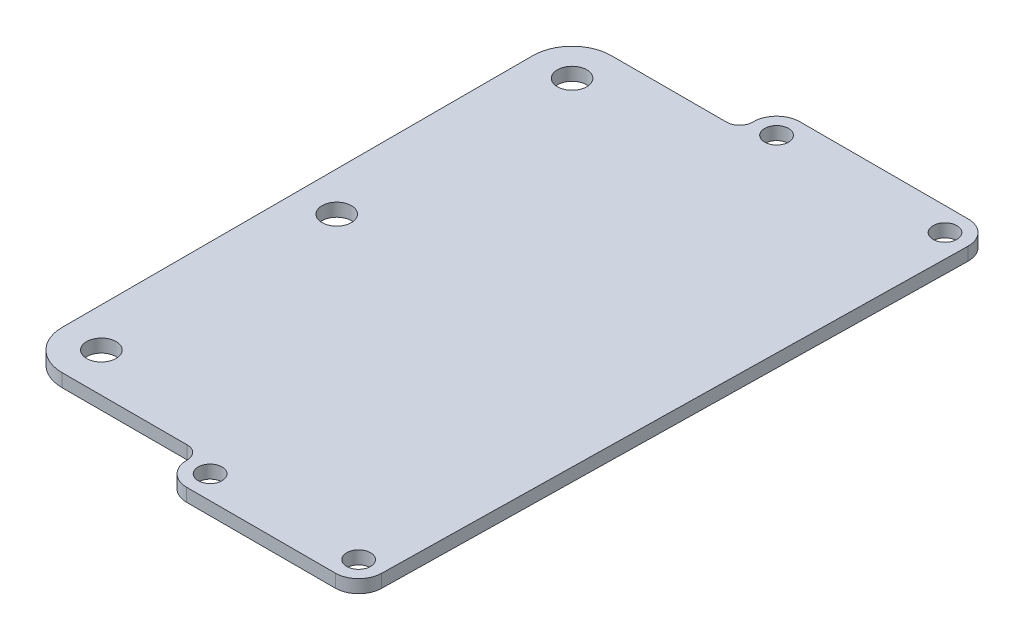
ISO-10303-21;
HEADER;
FILE_DESCRIPTION(('STEP AP214'),'2;1');
FILE_NAME('part.step','',(''),(''),'','','');
FILE_SCHEMA(('AUTOMOTIVE_DESIGN { 1 0 10303 214 1 1 1 1 }'));
ENDSEC;
DATA;
#1=APPLICATION_CONTEXT('core data for automotive mechanical design processes');
#2=APPLICATION_PROTOCOL_DEFINITION('international standard','automotive_design',2000,#1);
#3=PRODUCT_CONTEXT('',#1,'mechanical');
#4=PRODUCT('Part','Part','',(#3));
#5=PRODUCT_RELATED_PRODUCT_CATEGORY('part','',(#4));
#6=PRODUCT_DEFINITION_FORMATION('','',#4);
#7=PRODUCT_DEFINITION_CONTEXT('part definition',#1,'design');
#8=PRODUCT_DEFINITION('design','',#6,#7);
#9=PRODUCT_DEFINITION_SHAPE('','',#8);
#10=(LENGTH_UNIT() NAMED_UNIT(*) SI_UNIT(.MILLI.,.METRE.));
#11=(NAMED_UNIT(*) PLANE_ANGLE_UNIT() SI_UNIT($,.RADIAN.));
#12=(NAMED_UNIT(*) SI_UNIT($,.STERADIAN.) SOLID_ANGLE_UNIT());
#13=UNCERTAINTY_MEASURE_WITH_UNIT(LENGTH_MEASURE(1.E-05),#10,'distance_accuracy_value','');
#14=(GEOMETRIC_REPRESENTATION_CONTEXT(3) GLOBAL_UNCERTAINTY_ASSIGNED_CONTEXT((#13)) GLOBAL_UNIT_ASSIGNED_CONTEXT((#10,
#11,#12)) REPRESENTATION_CONTEXT('',''));
#15=CARTESIAN_POINT('',(0.,0.,0.));
#16=DIRECTION('',(0.,0.,1.));
#17=DIRECTION('',(1.,0.,0.));
#18=AXIS2_PLACEMENT_3D('',#15,#16,#17);
#19=CARTESIAN_POINT('',(0.,128.902574554,0.));
#20=DIRECTION('',(0.,1.,0.));
#21=DIRECTION('',(0.,0.,1.));
#22=AXIS2_PLACEMENT_3D('',#19,#20,#21);
#23=PLANE('',#22);
#24=CARTESIAN_POINT('',(-114.966812484,128.902574554,1163.375334154));
#25=DIRECTION('',(0.,1.,0.));
#26=DIRECTION('',(0.,0.,1.));
#27=AXIS2_PLACEMENT_3D('',#24,#25,#26);
#28=CIRCLE('',#27,3.57124);
#29=CARTESIAN_POINT('',(-114.966812484,128.902574554,1166.946574154));
#30=VERTEX_POINT('',#29);
#31=EDGE_CURVE('E476',#30,#30,#28,.T.);
#32=ORIENTED_EDGE('',*,*,#31,.T.);
#33=EDGE_LOOP('',(#32));
#34=FACE_BOUND('',#33,.T.);
#35=CARTESIAN_POINT('',(-114.966812484,128.902574554,1220.525334154));
#36=DIRECTION('',(0.,1.,0.));
#37=DIRECTION('',(0.,0.,1.));
#38=AXIS2_PLACEMENT_3D('',#35,#36,#37);
#39=CIRCLE('',#38,3.57124);
#40=CARTESIAN_POINT('',(-114.966812484,128.902574554,1224.096574154));
#41=VERTEX_POINT('',#40);
#42=EDGE_CURVE('E486',#41,#41,#39,.T.);
#43=ORIENTED_EDGE('',*,*,#42,.T.);
#44=EDGE_LOOP('',(#43));
#45=FACE_BOUND('',#44,.T.);
#46=CARTESIAN_POINT('',(-114.966812484,128.902574554,1277.675334154));
#47=DIRECTION('',(0.,1.,0.));
#48=DIRECTION('',(0.,0.,1.));
#49=AXIS2_PLACEMENT_3D('',#46,#47,#48);
#50=CIRCLE('',#49,3.57124);
#51=CARTESIAN_POINT('',(-114.966812484,128.902574554,1281.246574154));
#52=VERTEX_POINT('',#51);
#53=EDGE_CURVE('E492',#52,#52,#50,.T.);
#54=ORIENTED_EDGE('',*,*,#53,.T.);
#55=EDGE_LOOP('',(#54));
#56=FACE_BOUND('',#55,.T.);
#57=CARTESIAN_POINT('',(-39.66845,128.902574554,1290.508155834));
#58=DIRECTION('',(0.,-1.,0.));
#59=DIRECTION('',(0.,0.,-1.));
#60=AXIS2_PLACEMENT_3D('',#57,#58,#59);
#61=CIRCLE('',#60,2.9);
#62=CARTESIAN_POINT('',(-39.66845,128.902574554,1287.608155834));
#63=VERTEX_POINT('',#62);
#64=EDGE_CURVE('E495',#63,#63,#61,.T.);
#65=ORIENTED_EDGE('',*,*,#64,.F.);
#66=EDGE_LOOP('',(#65));
#67=FACE_BOUND('',#66,.T.);
#68=CARTESIAN_POINT('',(-37.25545,128.902574554,1150.542512474));
#69=DIRECTION('',(0.,-1.,0.));
#70=DIRECTION('',(0.,0.,-1.));
#71=AXIS2_PLACEMENT_3D('',#68,#69,#70);
#72=CIRCLE('',#71,2.9);
#73=CARTESIAN_POINT('',(-37.25545,128.902574554,1147.642512474));
#74=VERTEX_POINT('',#73);
#75=EDGE_CURVE('E507',#74,#74,#72,.T.);
#76=ORIENTED_EDGE('',*,*,#75,.F.);
#77=EDGE_LOOP('',(#76));
#78=FACE_BOUND('',#77,.T.);
#79=CARTESIAN_POINT('',(-78.14945,128.902574554,1150.542512474));
#80=DIRECTION('',(0.,-1.,0.));
#81=DIRECTION('',(0.,0.,-1.));
#82=AXIS2_PLACEMENT_3D('',#79,#80,#81);
#83=CIRCLE('',#82,2.9);
#84=CARTESIAN_POINT('',(-78.14945,128.902574554,1147.642512474));
#85=VERTEX_POINT('',#84);
#86=EDGE_CURVE('E513',#85,#85,#83,.T.);
#87=ORIENTED_EDGE('',*,*,#86,.F.);
#88=EDGE_LOOP('',(#87));
#89=FACE_BOUND('',#88,.T.);
#90=DIRECTION('',(0.0172373836267811,0.,0.999851425265626));
#91=VECTOR('',#90,1.);
#92=CARTESIAN_POINT('',(-103.629782530336,128.902574554,1.7865717560594));
#93=LINE('',#92,#91);
#94=CARTESIAN_POINT('',(-81.4155265980262,128.902574554,1290.32060546099));
#95=VERTEX_POINT('',#94);
#96=CARTESIAN_POINT('',(-81.4106067913896,128.902574554,1290.60597798527));
#97=VERTEX_POINT('',#96);
#98=EDGE_CURVE('E150',#95,#97,#93,.T.);
#99=ORIENTED_EDGE('',*,*,#98,.F.);
#100=CARTESIAN_POINT('',(-84.5900548732446,128.902574554,1290.375334154));
#101=DIRECTION('',(0.,1.,0.));
#102=DIRECTION('',(0.,0.,1.));
#103=AXIS2_PLACEMENT_3D('',#100,#101,#102);
#104=CIRCLE('',#103,3.175);
#105=CARTESIAN_POINT('',(-84.5900548732446,128.902574554,1287.200334154));
#106=VERTEX_POINT('',#105);
#107=EDGE_CURVE('E267',#95,#106,#104,.T.);
#108=ORIENTED_EDGE('',*,*,#107,.T.);
#109=DIRECTION('',(1.,0.,0.));
#110=VECTOR('',#109,1.);
#111=CARTESIAN_POINT('',(0.,128.902574554,1287.200334154));
#112=LINE('',#111,#110);
#113=CARTESIAN_POINT('',(-114.966812484,128.902574554,1287.200334154));
#114=VERTEX_POINT('',#113);
#115=EDGE_CURVE('E170',#114,#106,#112,.T.);
#116=ORIENTED_EDGE('',*,*,#115,.F.);
#117=CARTESIAN_POINT('',(-114.966812484,128.902574554,1277.675334154));
#118=DIRECTION('',(0.,1.,0.));
#119=DIRECTION('',(0.,0.,1.));
#120=AXIS2_PLACEMENT_3D('',#117,#118,#119);
#121=CIRCLE('',#120,9.52500000000006);
#122=CARTESIAN_POINT('',(-124.491812484,128.902574554,1277.675334154));
#123=VERTEX_POINT('',#122);
#124=EDGE_CURVE('E199',#123,#114,#121,.T.);
#125=ORIENTED_EDGE('',*,*,#124,.F.);
#126=DIRECTION('',(0.,0.,-1.));
#127=VECTOR('',#126,1.);
#128=CARTESIAN_POINT('',(-124.491812484002,128.902574554,2.41843703581903E-13));
#129=LINE('',#128,#127);
#130=CARTESIAN_POINT('',(-124.491812484,128.902574554,1163.375334154));
#131=VERTEX_POINT('',#130);
#132=EDGE_CURVE('E197',#123,#131,#129,.T.);
#133=ORIENTED_EDGE('',*,*,#132,.T.);
#134=CARTESIAN_POINT('',(-114.966812484,128.902574554,1163.375334154));
#135=DIRECTION('',(0.,1.,0.));
#136=DIRECTION('',(0.,0.,1.));
#137=AXIS2_PLACEMENT_3D('',#134,#135,#136);
#138=CIRCLE('',#137,9.52500000000006);
#139=CARTESIAN_POINT('',(-114.966812484,128.902574554,1153.850334154));
#140=VERTEX_POINT('',#139);
#141=EDGE_CURVE('E195',#131,#140,#138,.F.);
#142=ORIENTED_EDGE('',*,*,#141,.T.);
#143=DIRECTION('',(1.,0.,0.));
#144=VECTOR('',#143,1.);
#145=CARTESIAN_POINT('',(0.,128.902574554,1153.850334154));
#146=LINE('',#145,#144);
#147=CARTESIAN_POINT('',(-86.9984531963734,128.902574554,1153.850334154));
#148=VERTEX_POINT('',#147);
#149=EDGE_CURVE('E193',#140,#148,#146,.T.);
#150=ORIENTED_EDGE('',*,*,#149,.T.);
#151=CARTESIAN_POINT('',(-86.9984531963734,128.902574554,1150.675334154));
#152=DIRECTION('',(0.,1.,0.));
#153=DIRECTION('',(0.,0.,1.));
#154=AXIS2_PLACEMENT_3D('',#151,#152,#153);
#155=CIRCLE('',#154,3.175);
#156=CARTESIAN_POINT('',(-83.8238107898545,128.902574554,1150.62768343804));
#157=VERTEX_POINT('',#156);
#158=EDGE_CURVE('E11',#148,#157,#155,.T.);
#159=ORIENTED_EDGE('',*,*,#158,.T.);
#160=CARTESIAN_POINT('',(-78.1494500000001,128.902574554,1150.542512474));
#161=DIRECTION('',(0.,1.,0.));
#162=DIRECTION('',(0.,0.,1.));
#163=AXIS2_PLACEMENT_3D('',#160,#161,#162);
#164=CIRCLE('',#163,5.67499995300015);
#165=CARTESIAN_POINT('',(-78.1494500000001,128.902574554,1144.867512521));
#166=VERTEX_POINT('',#165);
#167=EDGE_CURVE('E190',#166,#157,#164,.T.);
#168=ORIENTED_EDGE('',*,*,#167,.F.);
#169=DIRECTION('',(1.,0.,0.));
#170=VECTOR('',#169,1.);
#171=CARTESIAN_POINT('',(-6.21635581036892E-12,128.902574554,1144.867512521));
#172=LINE('',#171,#170);
#173=CARTESIAN_POINT('',(-37.2554499999998,128.902574554,1144.867512521));
#174=VERTEX_POINT('',#173);
#175=EDGE_CURVE('E188',#166,#174,#172,.T.);
#176=ORIENTED_EDGE('',*,*,#175,.T.);
#177=CARTESIAN_POINT('',(-37.2554499999998,128.902574554,1150.542512474));
#178=DIRECTION('',(0.,1.,0.));
#179=DIRECTION('',(0.,0.,1.));
#180=AXIS2_PLACEMENT_3D('',#177,#178,#179);
#181=CIRCLE('',#180,5.67499995300002);
#182=CARTESIAN_POINT('',(-31.5812932086103,128.902574554,1150.64033462527));
#183=VERTEX_POINT('',#182);
#184=EDGE_CURVE('E186',#174,#183,#181,.F.);
#185=ORIENTED_EDGE('',*,*,#184,.T.);
#186=DIRECTION('',(-0.0172373836267851,0.,0.999851425265626));
#187=VECTOR('',#186,1.);
#188=CARTESIAN_POINT('',(-11.7408275124326,128.902574554,-0.202411221121126));
#189=LINE('',#188,#187);
#190=CARTESIAN_POINT('',(-33.9942932086104,128.902574554,1290.60597798527));
#191=VERTEX_POINT('',#190);
#192=EDGE_CURVE('E184',#183,#191,#189,.T.);
#193=ORIENTED_EDGE('',*,*,#192,.T.);
#194=CARTESIAN_POINT('',(-39.66845,128.902574554,1290.508155834));
#195=DIRECTION('',(0.,1.,0.));
#196=DIRECTION('',(0.,0.,1.));
#197=AXIS2_PLACEMENT_3D('',#194,#195,#196);
#198=CIRCLE('',#197,5.67499995300014);
#199=CARTESIAN_POINT('',(-39.66845,128.902574554,1296.183155787));
#200=VERTEX_POINT('',#199);
#201=EDGE_CURVE('E178',#200,#191,#198,.T.);
#202=ORIENTED_EDGE('',*,*,#201,.F.);
#203=DIRECTION('',(1.,0.,0.));
#204=VECTOR('',#203,1.);
#205=CARTESIAN_POINT('',(1.59593255371634E-11,128.902574554,1296.183155787));
#206=LINE('',#205,#204);
#207=CARTESIAN_POINT('',(-75.73645,128.902574554,1296.183155787));
#208=VERTEX_POINT('',#207);
#209=EDGE_CURVE('E176',#208,#200,#206,.T.);
#210=ORIENTED_EDGE('',*,*,#209,.F.);
#211=CARTESIAN_POINT('',(-75.73645,128.902574554,1290.508155834));
#212=DIRECTION('',(0.,1.,0.));
#213=DIRECTION('',(0.,0.,1.));
#214=AXIS2_PLACEMENT_3D('',#211,#212,#213);
#215=CIRCLE('',#214,5.67499995300026);
#216=EDGE_CURVE('E161',#97,#208,#215,.T.);
#217=ORIENTED_EDGE('',*,*,#216,.F.);
#218=EDGE_LOOP('',(#99,#108,#116,#125,#133,#142,#150,#159,#168,#176,#185,#193,#202,#210,#217));
#219=FACE_BOUND('',#218,.T.);
#220=CARTESIAN_POINT('',(-75.73645,128.902574554,1290.508155834));
#221=DIRECTION('',(0.,-1.,0.));
#222=DIRECTION('',(0.,0.,-1.));
#223=AXIS2_PLACEMENT_3D('',#220,#221,#222);
#224=CIRCLE('',#223,2.9);
#225=CARTESIAN_POINT('',(-75.73645,128.902574554,1287.608155834));
#226=VERTEX_POINT('',#225);
#227=EDGE_CURVE('E501',#226,#226,#224,.T.);
#228=ORIENTED_EDGE('',*,*,#227,.F.);
#229=EDGE_LOOP('',(#228));
#230=FACE_BOUND('',#229,.T.);
#231=ADVANCED_FACE('F43',(#34,#45,#56,#67,#78,#89,#219,#230),#23,.F.);
#232=CARTESIAN_POINT('',(-103.629782530336,128.902574554,1.7865717560594));
#233=DIRECTION('',(-0.999851425265626,0.,0.0172373836267811));
#234=DIRECTION('',(0.0172373836267811,0.,0.999851425265626));
#235=AXIS2_PLACEMENT_3D('',#232,#233,#234);
#236=PLANE('',#235);
#237=DIRECTION('',(0.0172373836267811,0.,0.999851425265626));
#238=VECTOR('',#237,1.);
#239=CARTESIAN_POINT('',(-103.629782530336,132.077574554,1.7865717560594));
#240=LINE('',#239,#238);
#241=CARTESIAN_POINT('',(-81.4155265980262,132.077574554,1290.32060546099));
#242=VERTEX_POINT('',#241);
#243=CARTESIAN_POINT('',(-81.4106067913896,132.077574554,1290.60597798527));
#244=VERTEX_POINT('',#243);
#245=EDGE_CURVE('E204',#242,#244,#240,.T.);
#246=ORIENTED_EDGE('',*,*,#245,.F.);
#247=DIRECTION('',(0.,1.,0.));
#248=VECTOR('',#247,1.);
#249=CARTESIAN_POINT('',(-81.4155265980262,128.902574554,1290.32060546098));
#250=LINE('',#249,#248);
#251=EDGE_CURVE('E157',#242,#95,#250,.F.);
#252=ORIENTED_EDGE('',*,*,#251,.T.);
#253=ORIENTED_EDGE('',*,*,#98,.T.);
#254=DIRECTION('',(0.,1.,0.));
#255=VECTOR('',#254,1.);
#256=CARTESIAN_POINT('',(-81.4106067913896,128.902574554,1290.60597798527));
#257=LINE('',#256,#255);
#258=EDGE_CURVE('E154',#97,#244,#257,.T.);
#259=ORIENTED_EDGE('',*,*,#258,.T.);
#260=EDGE_LOOP('',(#246,#252,#253,#259));
#261=FACE_BOUND('',#260,.T.);
#262=ADVANCED_FACE('F153',(#261),#236,.T.);
#263=CARTESIAN_POINT('',(0.,128.902574554,1287.200334154));
#264=DIRECTION('',(0.,0.,1.));
#265=DIRECTION('',(1.,0.,0.));
#266=AXIS2_PLACEMENT_3D('',#263,#264,#265);
#267=PLANE('',#266);
#268=ORIENTED_EDGE('',*,*,#115,.T.);
#269=DIRECTION('',(0.,1.,0.));
#270=VECTOR('',#269,1.);
#271=CARTESIAN_POINT('',(-84.5900548732446,132.077574554,1287.200334154));
#272=LINE('',#271,#270);
#273=CARTESIAN_POINT('',(-84.5900548732446,132.077574554,1287.200334154));
#274=VERTEX_POINT('',#273);
#275=EDGE_CURVE('E236',#106,#274,#272,.T.);
#276=ORIENTED_EDGE('',*,*,#275,.T.);
#277=DIRECTION('',(1.,0.,0.));
#278=VECTOR('',#277,1.);
#279=CARTESIAN_POINT('',(0.,132.077574554,1287.200334154));
#280=LINE('',#279,#278);
#281=CARTESIAN_POINT('',(-114.966812484,132.077574554,1287.200334154));
#282=VERTEX_POINT('',#281);
#283=EDGE_CURVE('E162',#282,#274,#280,.T.);
#284=ORIENTED_EDGE('',*,*,#283,.F.);
#285=DIRECTION('',(0.,1.,0.));
#286=VECTOR('',#285,1.);
#287=CARTESIAN_POINT('',(-114.966812484,128.902574554,1287.200334154));
#288=LINE('',#287,#286);
#289=EDGE_CURVE('E234',#114,#282,#288,.T.);
#290=ORIENTED_EDGE('',*,*,#289,.F.);
#291=EDGE_LOOP('',(#268,#276,#284,#290));
#292=FACE_BOUND('',#291,.T.);
#293=ADVANCED_FACE('F273',(#292),#267,.T.);
#294=CARTESIAN_POINT('',(-114.966812484,128.902574554,1277.675334154));
#295=DIRECTION('',(0.,1.,0.));
#296=DIRECTION('',(0.,0.,1.));
#297=AXIS2_PLACEMENT_3D('',#294,#295,#296);
#298=CYLINDRICAL_SURFACE('',#297,9.52500000000006);
#299=CARTESIAN_POINT('',(-114.966812484,132.077574554,1277.675334154));
#300=DIRECTION('',(0.,1.,0.));
#301=DIRECTION('',(0.,0.,1.));
#302=AXIS2_PLACEMENT_3D('',#299,#300,#301);
#303=CIRCLE('',#302,9.52500000000006);
#304=CARTESIAN_POINT('',(-124.491812484,132.077574554,1277.675334154));
#305=VERTEX_POINT('',#304);
#306=EDGE_CURVE('E229',#305,#282,#303,.T.);
#307=ORIENTED_EDGE('',*,*,#306,.F.);
#308=DIRECTION('',(0.,1.,0.));
#309=VECTOR('',#308,1.);
#310=CARTESIAN_POINT('',(-124.491812484,128.902574554,1277.675334154));
#311=LINE('',#310,#309);
#312=EDGE_CURVE('E237',#123,#305,#311,.T.);
#313=ORIENTED_EDGE('',*,*,#312,.F.);
#314=ORIENTED_EDGE('',*,*,#124,.T.);
#315=ORIENTED_EDGE('',*,*,#289,.T.);
#316=EDGE_LOOP('',(#307,#313,#314,#315));
#317=FACE_BOUND('',#316,.T.);
#318=ADVANCED_FACE('F281',(#317),#298,.T.);
#319=CARTESIAN_POINT('',(-124.491812484002,128.902574554,2.41843703581903E-13));
#320=DIRECTION('',(1.,0.,0.));
#321=DIRECTION('',(0.,0.,-1.));
#322=AXIS2_PLACEMENT_3D('',#319,#320,#321);
#323=PLANE('',#322);
#324=DIRECTION('',(0.,0.,-1.));
#325=VECTOR('',#324,1.);
#326=CARTESIAN_POINT('',(-124.491812484002,132.077574554,2.41843703581903E-13));
#327=LINE('',#326,#325);
#328=CARTESIAN_POINT('',(-124.491812484,132.077574554,1163.375334154));
#329=VERTEX_POINT('',#328);
#330=EDGE_CURVE('E227',#305,#329,#327,.T.);
#331=ORIENTED_EDGE('',*,*,#330,.T.);
#332=DIRECTION('',(0.,1.,0.));
#333=VECTOR('',#332,1.);
#334=CARTESIAN_POINT('',(-124.491812484,128.902574554,1163.375334154));
#335=LINE('',#334,#333);
#336=EDGE_CURVE('E239',#131,#329,#335,.T.);
#337=ORIENTED_EDGE('',*,*,#336,.F.);
#338=ORIENTED_EDGE('',*,*,#132,.F.);
#339=ORIENTED_EDGE('',*,*,#312,.T.);
#340=EDGE_LOOP('',(#331,#337,#338,#339));
#341=FACE_BOUND('',#340,.T.);
#342=ADVANCED_FACE('F287',(#341),#323,.F.);
#343=CARTESIAN_POINT('',(-114.966812484,128.902574554,1163.375334154));
#344=DIRECTION('',(0.,1.,0.));
#345=DIRECTION('',(0.,0.,1.));
#346=AXIS2_PLACEMENT_3D('',#343,#344,#345);
#347=CYLINDRICAL_SURFACE('',#346,9.52500000000006);
#348=CARTESIAN_POINT('',(-114.966812484,132.077574554,1163.375334154));
#349=DIRECTION('',(0.,1.,0.));
#350=DIRECTION('',(0.,0.,1.));
#351=AXIS2_PLACEMENT_3D('',#348,#349,#350);
#352=CIRCLE('',#351,9.52500000000006);
#353=CARTESIAN_POINT('',(-114.966812484,132.077574554,1153.850334154));
#354=VERTEX_POINT('',#353);
#355=EDGE_CURVE('E225',#329,#354,#352,.F.);
#356=ORIENTED_EDGE('',*,*,#355,.T.);
#357=DIRECTION('',(0.,1.,0.));
#358=VECTOR('',#357,1.);
#359=CARTESIAN_POINT('',(-114.966812484,128.902574554,1153.850334154));
#360=LINE('',#359,#358);
#361=EDGE_CURVE('E242',#140,#354,#360,.T.);
#362=ORIENTED_EDGE('',*,*,#361,.F.);
#363=ORIENTED_EDGE('',*,*,#141,.F.);
#364=ORIENTED_EDGE('',*,*,#336,.T.);
#365=EDGE_LOOP('',(#356,#362,#363,#364));
#366=FACE_BOUND('',#365,.T.);
#367=ADVANCED_FACE('F289',(#366),#347,.T.);
#368=CARTESIAN_POINT('',(0.,128.902574554,1153.850334154));
#369=DIRECTION('',(0.,0.,1.));
#370=DIRECTION('',(1.,0.,0.));
#371=AXIS2_PLACEMENT_3D('',#368,#369,#370);
#372=PLANE('',#371);
#373=DIRECTION('',(1.,0.,0.));
#374=VECTOR('',#373,1.);
#375=CARTESIAN_POINT('',(0.,132.077574554,1153.850334154));
#376=LINE('',#375,#374);
#377=CARTESIAN_POINT('',(-86.9984531963734,132.077574554,1153.850334154));
#378=VERTEX_POINT('',#377);
#379=EDGE_CURVE('E223',#354,#378,#376,.T.);
#380=ORIENTED_EDGE('',*,*,#379,.T.);
#381=DIRECTION('',(0.,1.,0.));
#382=VECTOR('',#381,1.);
#383=CARTESIAN_POINT('',(-86.9984531963734,128.902574554,1153.850334154));
#384=LINE('',#383,#382);
#385=EDGE_CURVE('E58',#378,#148,#384,.F.);
#386=ORIENTED_EDGE('',*,*,#385,.T.);
#387=ORIENTED_EDGE('',*,*,#149,.F.);
#388=ORIENTED_EDGE('',*,*,#361,.T.);
#389=EDGE_LOOP('',(#380,#386,#387,#388));
#390=FACE_BOUND('',#389,.T.);
#391=ADVANCED_FACE('F290',(#390),#372,.F.);
#392=CARTESIAN_POINT('',(-78.1494500000001,128.902574554,1150.542512474));
#393=DIRECTION('',(0.,1.,0.));
#394=DIRECTION('',(0.,0.,1.));
#395=AXIS2_PLACEMENT_3D('',#392,#393,#394);
#396=CYLINDRICAL_SURFACE('',#395,5.67499995300015);
#397=ORIENTED_EDGE('',*,*,#167,.T.);
#398=DIRECTION('',(0.,1.,0.));
#399=VECTOR('',#398,1.);
#400=CARTESIAN_POINT('',(-83.8238107898545,128.902574554,1150.62768343804));
#401=LINE('',#400,#399);
#402=CARTESIAN_POINT('',(-83.8238107898545,132.077574554,1150.62768343804));
#403=VERTEX_POINT('',#402);
#404=EDGE_CURVE('E261',#157,#403,#401,.T.);
#405=ORIENTED_EDGE('',*,*,#404,.T.);
#406=CARTESIAN_POINT('',(-78.1494500000001,132.077574554,1150.542512474));
#407=DIRECTION('',(0.,1.,0.));
#408=DIRECTION('',(0.,0.,1.));
#409=AXIS2_PLACEMENT_3D('',#406,#407,#408);
#410=CIRCLE('',#409,5.67499995300015);
#411=CARTESIAN_POINT('',(-78.1494500000001,132.077574554,1144.867512521));
#412=VERTEX_POINT('',#411);
#413=EDGE_CURVE('E221',#412,#403,#410,.T.);
#414=ORIENTED_EDGE('',*,*,#413,.F.);
#415=DIRECTION('',(0.,1.,0.));
#416=VECTOR('',#415,1.);
#417=CARTESIAN_POINT('',(-78.1494500000001,128.902574554,1144.867512521));
#418=LINE('',#417,#416);
#419=EDGE_CURVE('E245',#166,#412,#418,.T.);
#420=ORIENTED_EDGE('',*,*,#419,.F.);
#421=EDGE_LOOP('',(#397,#405,#414,#420));
#422=FACE_BOUND('',#421,.T.);
#423=ADVANCED_FACE('F297',(#422),#396,.T.);
#424=CARTESIAN_POINT('',(-6.21635581036892E-12,128.902574554,1144.867512521));
#425=DIRECTION('',(0.,0.,1.));
#426=DIRECTION('',(1.,0.,0.));
#427=AXIS2_PLACEMENT_3D('',#424,#425,#426);
#428=PLANE('',#427);
#429=DIRECTION('',(1.,0.,0.));
#430=VECTOR('',#429,1.);
#431=CARTESIAN_POINT('',(-6.21635581036892E-12,132.077574554,1144.867512521));
#432=LINE('',#431,#430);
#433=CARTESIAN_POINT('',(-37.2554499999998,132.077574554,1144.867512521));
#434=VERTEX_POINT('',#433);
#435=EDGE_CURVE('E219',#412,#434,#432,.T.);
#436=ORIENTED_EDGE('',*,*,#435,.T.);
#437=DIRECTION('',(0.,1.,0.));
#438=VECTOR('',#437,1.);
#439=CARTESIAN_POINT('',(-37.2554499999998,128.902574554,1144.867512521));
#440=LINE('',#439,#438);
#441=EDGE_CURVE('E247',#174,#434,#440,.T.);
#442=ORIENTED_EDGE('',*,*,#441,.F.);
#443=ORIENTED_EDGE('',*,*,#175,.F.);
#444=ORIENTED_EDGE('',*,*,#419,.T.);
#445=EDGE_LOOP('',(#436,#442,#443,#444));
#446=FACE_BOUND('',#445,.T.);
#447=ADVANCED_FACE('F303',(#446),#428,.F.);
#448=CARTESIAN_POINT('',(-37.2554499999998,128.902574554,1150.542512474));
#449=DIRECTION('',(0.,1.,0.));
#450=DIRECTION('',(0.,0.,1.));
#451=AXIS2_PLACEMENT_3D('',#448,#449,#450);
#452=CYLINDRICAL_SURFACE('',#451,5.67499995300002);
#453=CARTESIAN_POINT('',(-37.2554499999998,132.077574554,1150.542512474));
#454=DIRECTION('',(0.,1.,0.));
#455=DIRECTION('',(0.,0.,1.));
#456=AXIS2_PLACEMENT_3D('',#453,#454,#455);
#457=CIRCLE('',#456,5.67499995300002);
#458=CARTESIAN_POINT('',(-31.5812932086103,132.077574554,1150.64033462527));
#459=VERTEX_POINT('',#458);
#460=EDGE_CURVE('E217',#434,#459,#457,.F.);
#461=ORIENTED_EDGE('',*,*,#460,.T.);
#462=DIRECTION('',(0.,1.,0.));
#463=VECTOR('',#462,1.);
#464=CARTESIAN_POINT('',(-31.5812932086103,128.902574554,1150.64033462527));
#465=LINE('',#464,#463);
#466=EDGE_CURVE('E250',#183,#459,#465,.T.);
#467=ORIENTED_EDGE('',*,*,#466,.F.);
#468=ORIENTED_EDGE('',*,*,#184,.F.);
#469=ORIENTED_EDGE('',*,*,#441,.T.);
#470=EDGE_LOOP('',(#461,#467,#468,#469));
#471=FACE_BOUND('',#470,.T.);
#472=ADVANCED_FACE('F307',(#471),#452,.T.);
#473=CARTESIAN_POINT('',(-11.7408275124326,128.902574554,-0.202411221121126));
#474=DIRECTION('',(-0.999851425265626,0.,-0.0172373836267851));
#475=DIRECTION('',(-0.0172373836267851,0.,0.999851425265626));
#476=AXIS2_PLACEMENT_3D('',#473,#474,#475);
#477=PLANE('',#476);
#478=DIRECTION('',(-0.0172373836267851,0.,0.999851425265626));
#479=VECTOR('',#478,1.);
#480=CARTESIAN_POINT('',(-11.7408275124326,132.077574554,-0.202411221121126));
#481=LINE('',#480,#479);
#482=CARTESIAN_POINT('',(-33.9942932086104,132.077574554,1290.60597798527));
#483=VERTEX_POINT('',#482);
#484=EDGE_CURVE('E214',#459,#483,#481,.T.);
#485=ORIENTED_EDGE('',*,*,#484,.T.);
#486=DIRECTION('',(0.,1.,0.));
#487=VECTOR('',#486,1.);
#488=CARTESIAN_POINT('',(-33.9942932086104,128.902574554,1290.60597798527));
#489=LINE('',#488,#487);
#490=EDGE_CURVE('E253',#191,#483,#489,.T.);
#491=ORIENTED_EDGE('',*,*,#490,.F.);
#492=ORIENTED_EDGE('',*,*,#192,.F.);
#493=ORIENTED_EDGE('',*,*,#466,.T.);
#494=EDGE_LOOP('',(#485,#491,#492,#493));
#495=FACE_BOUND('',#494,.T.);
#496=ADVANCED_FACE('F312',(#495),#477,.F.);
#497=CARTESIAN_POINT('',(-39.66845,128.902574554,1290.508155834));
#498=DIRECTION('',(0.,1.,0.));
#499=DIRECTION('',(0.,0.,1.));
#500=AXIS2_PLACEMENT_3D('',#497,#498,#499);
#501=CYLINDRICAL_SURFACE('',#500,5.67499995300014);
#502=CARTESIAN_POINT('',(-39.66845,132.077574554,1290.508155834));
#503=DIRECTION('',(0.,1.,0.));
#504=DIRECTION('',(0.,0.,1.));
#505=AXIS2_PLACEMENT_3D('',#502,#503,#504);
#506=CIRCLE('',#505,5.67499995300014);
#507=CARTESIAN_POINT('',(-39.66845,132.077574554,1296.183155787));
#508=VERTEX_POINT('',#507);
#509=EDGE_CURVE('E211',#508,#483,#506,.T.);
#510=ORIENTED_EDGE('',*,*,#509,.F.);
#511=DIRECTION('',(0.,1.,0.));
#512=VECTOR('',#511,1.);
#513=CARTESIAN_POINT('',(-39.66845,128.902574554,1296.183155787));
#514=LINE('',#513,#512);
#515=EDGE_CURVE('E255',#200,#508,#514,.T.);
#516=ORIENTED_EDGE('',*,*,#515,.F.);
#517=ORIENTED_EDGE('',*,*,#201,.T.);
#518=ORIENTED_EDGE('',*,*,#490,.T.);
#519=EDGE_LOOP('',(#510,#516,#517,#518));
#520=FACE_BOUND('',#519,.T.);
#521=ADVANCED_FACE('F315',(#520),#501,.T.);
#522=CARTESIAN_POINT('',(1.59593255371634E-11,128.902574554,1296.183155787));
#523=DIRECTION('',(0.,0.,1.));
#524=DIRECTION('',(1.,0.,0.));
#525=AXIS2_PLACEMENT_3D('',#522,#523,#524);
#526=PLANE('',#525);
#527=DIRECTION('',(1.,0.,0.));
#528=VECTOR('',#527,1.);
#529=CARTESIAN_POINT('',(1.59593255371634E-11,132.077574554,1296.183155787));
#530=LINE('',#529,#528);
#531=CARTESIAN_POINT('',(-75.73645,132.077574554,1296.183155787));
#532=VERTEX_POINT('',#531);
#533=EDGE_CURVE('E208',#532,#508,#530,.T.);
#534=ORIENTED_EDGE('',*,*,#533,.F.);
#535=DIRECTION('',(0.,1.,0.));
#536=VECTOR('',#535,1.);
#537=CARTESIAN_POINT('',(-75.73645,128.902574554,1296.183155787));
#538=LINE('',#537,#536);
#539=EDGE_CURVE('E169',#208,#532,#538,.T.);
#540=ORIENTED_EDGE('',*,*,#539,.F.);
#541=ORIENTED_EDGE('',*,*,#209,.T.);
#542=ORIENTED_EDGE('',*,*,#515,.T.);
#543=EDGE_LOOP('',(#534,#540,#541,#542));
#544=FACE_BOUND('',#543,.T.);
#545=ADVANCED_FACE('F318',(#544),#526,.T.);
#546=CARTESIAN_POINT('',(-75.73645,128.902574554,1290.508155834));
#547=DIRECTION('',(0.,1.,0.));
#548=DIRECTION('',(0.,0.,1.));
#549=AXIS2_PLACEMENT_3D('',#546,#547,#548);
#550=CYLINDRICAL_SURFACE('',#549,5.67499995300026);
#551=CARTESIAN_POINT('',(-75.73645,132.077574554,1290.508155834));
#552=DIRECTION('',(0.,1.,0.));
#553=DIRECTION('',(0.,0.,1.));
#554=AXIS2_PLACEMENT_3D('',#551,#552,#553);
#555=CIRCLE('',#554,5.67499995300026);
#556=EDGE_CURVE('E168',#244,#532,#555,.T.);
#557=ORIENTED_EDGE('',*,*,#556,.F.);
#558=ORIENTED_EDGE('',*,*,#258,.F.);
#559=ORIENTED_EDGE('',*,*,#216,.T.);
#560=ORIENTED_EDGE('',*,*,#539,.T.);
#561=EDGE_LOOP('',(#557,#558,#559,#560));
#562=FACE_BOUND('',#561,.T.);
#563=ADVANCED_FACE('F166',(#562),#550,.T.);
#564=CARTESIAN_POINT('',(0.,132.077574554,0.));
#565=DIRECTION('',(0.,1.,0.));
#566=DIRECTION('',(0.,0.,1.));
#567=AXIS2_PLACEMENT_3D('',#564,#565,#566);
#568=PLANE('',#567);
#569=CARTESIAN_POINT('',(-114.966812484,132.077574554,1163.375334154));
#570=DIRECTION('',(0.,1.,0.));
#571=DIRECTION('',(0.,0.,1.));
#572=AXIS2_PLACEMENT_3D('',#569,#570,#571);
#573=CIRCLE('',#572,3.57124);
#574=CARTESIAN_POINT('',(-114.966812484,132.077574554,1166.946574154));
#575=VERTEX_POINT('',#574);
#576=EDGE_CURVE('E479',#575,#575,#573,.T.);
#577=ORIENTED_EDGE('',*,*,#576,.F.);
#578=EDGE_LOOP('',(#577));
#579=FACE_BOUND('',#578,.T.);
#580=CARTESIAN_POINT('',(-114.966812484,132.077574554,1220.525334154));
#581=DIRECTION('',(0.,1.,0.));
#582=DIRECTION('',(0.,0.,1.));
#583=AXIS2_PLACEMENT_3D('',#580,#581,#582);
#584=CIRCLE('',#583,3.57124);
#585=CARTESIAN_POINT('',(-114.966812484,132.077574554,1224.096574154));
#586=VERTEX_POINT('',#585);
#587=EDGE_CURVE('E481',#586,#586,#584,.T.);
#588=ORIENTED_EDGE('',*,*,#587,.F.);
#589=EDGE_LOOP('',(#588));
#590=FACE_BOUND('',#589,.T.);
#591=CARTESIAN_POINT('',(-114.966812484,132.077574554,1277.675334154));
#592=DIRECTION('',(0.,1.,0.));
#593=DIRECTION('',(0.,0.,1.));
#594=AXIS2_PLACEMENT_3D('',#591,#592,#593);
#595=CIRCLE('',#594,3.57124);
#596=CARTESIAN_POINT('',(-114.966812484,132.077574554,1281.246574154));
#597=VERTEX_POINT('',#596);
#598=EDGE_CURVE('E489',#597,#597,#595,.T.);
#599=ORIENTED_EDGE('',*,*,#598,.F.);
#600=EDGE_LOOP('',(#599));
#601=FACE_BOUND('',#600,.T.);
#602=CARTESIAN_POINT('',(-39.66845,132.077574554,1290.508155834));
#603=DIRECTION('',(0.,-1.,0.));
#604=DIRECTION('',(0.,0.,-1.));
#605=AXIS2_PLACEMENT_3D('',#602,#603,#604);
#606=CIRCLE('',#605,2.9);
#607=CARTESIAN_POINT('',(-39.66845,132.077574554,1287.608155834));
#608=VERTEX_POINT('',#607);
#609=EDGE_CURVE('E498',#608,#608,#606,.T.);
#610=ORIENTED_EDGE('',*,*,#609,.T.);
#611=EDGE_LOOP('',(#610));
#612=FACE_BOUND('',#611,.T.);
#613=CARTESIAN_POINT('',(-75.73645,132.077574554,1290.508155834));
#614=DIRECTION('',(0.,-1.,0.));
#615=DIRECTION('',(0.,0.,-1.));
#616=AXIS2_PLACEMENT_3D('',#613,#614,#615);
#617=CIRCLE('',#616,2.9);
#618=CARTESIAN_POINT('',(-75.73645,132.077574554,1287.608155834));
#619=VERTEX_POINT('',#618);
#620=EDGE_CURVE('E504',#619,#619,#617,.T.);
#621=ORIENTED_EDGE('',*,*,#620,.T.);
#622=EDGE_LOOP('',(#621));
#623=FACE_BOUND('',#622,.T.);
#624=CARTESIAN_POINT('',(-37.25545,132.077574554,1150.542512474));
#625=DIRECTION('',(0.,-1.,0.));
#626=DIRECTION('',(0.,0.,-1.));
#627=AXIS2_PLACEMENT_3D('',#624,#625,#626);
#628=CIRCLE('',#627,2.9);
#629=CARTESIAN_POINT('',(-37.25545,132.077574554,1147.642512474));
#630=VERTEX_POINT('',#629);
#631=EDGE_CURVE('E510',#630,#630,#628,.T.);
#632=ORIENTED_EDGE('',*,*,#631,.T.);
#633=EDGE_LOOP('',(#632));
#634=FACE_BOUND('',#633,.T.);
#635=CARTESIAN_POINT('',(-78.14945,132.077574554,1150.542512474));
#636=DIRECTION('',(0.,-1.,0.));
#637=DIRECTION('',(0.,0.,-1.));
#638=AXIS2_PLACEMENT_3D('',#635,#636,#637);
#639=CIRCLE('',#638,2.9);
#640=CARTESIAN_POINT('',(-78.14945,132.077574554,1147.642512474));
#641=VERTEX_POINT('',#640);
#642=EDGE_CURVE('E206',#641,#641,#639,.T.);
#643=ORIENTED_EDGE('',*,*,#642,.T.);
#644=EDGE_LOOP('',(#643));
#645=FACE_BOUND('',#644,.T.);
#646=ORIENTED_EDGE('',*,*,#283,.T.);
#647=CARTESIAN_POINT('',(-84.5900548732446,132.077574554,1290.375334154));
#648=DIRECTION('',(0.,1.,0.));
#649=DIRECTION('',(0.,0.,1.));
#650=AXIS2_PLACEMENT_3D('',#647,#648,#649);
#651=CIRCLE('',#650,3.175);
#652=EDGE_CURVE('E265',#274,#242,#651,.F.);
#653=ORIENTED_EDGE('',*,*,#652,.T.);
#654=ORIENTED_EDGE('',*,*,#245,.T.);
#655=ORIENTED_EDGE('',*,*,#556,.T.);
#656=ORIENTED_EDGE('',*,*,#533,.T.);
#657=ORIENTED_EDGE('',*,*,#509,.T.);
#658=ORIENTED_EDGE('',*,*,#484,.F.);
#659=ORIENTED_EDGE('',*,*,#460,.F.);
#660=ORIENTED_EDGE('',*,*,#435,.F.);
#661=ORIENTED_EDGE('',*,*,#413,.T.);
#662=CARTESIAN_POINT('',(-86.9984531963734,132.077574554,1150.675334154));
#663=DIRECTION('',(0.,1.,0.));
#664=DIRECTION('',(0.,0.,1.));
#665=AXIS2_PLACEMENT_3D('',#662,#663,#664);
#666=CIRCLE('',#665,3.175);
#667=EDGE_CURVE('E51',#403,#378,#666,.F.);
#668=ORIENTED_EDGE('',*,*,#667,.T.);
#669=ORIENTED_EDGE('',*,*,#379,.F.);
#670=ORIENTED_EDGE('',*,*,#355,.F.);
#671=ORIENTED_EDGE('',*,*,#330,.F.);
#672=ORIENTED_EDGE('',*,*,#306,.T.);
#673=EDGE_LOOP('',(#646,#653,#654,#655,#656,#657,#658,#659,#660,#661,#668,#669,#670,#671,#672));
#674=FACE_BOUND('',#673,.T.);
#675=ADVANCED_FACE('F276',(#579,#590,#601,#612,#623,#634,#645,#674),#568,.T.);
#676=CARTESIAN_POINT('',(-78.14945,128.902574554,1150.542512474));
#677=DIRECTION('',(0.,-1.,0.));
#678=DIRECTION('',(0.,0.,-1.));
#679=AXIS2_PLACEMENT_3D('',#676,#677,#678);
#680=CYLINDRICAL_SURFACE('',#679,2.9);
#681=ORIENTED_EDGE('',*,*,#642,.F.);
#682=EDGE_LOOP('',(#681));
#683=FACE_BOUND('',#682,.T.);
#684=ORIENTED_EDGE('',*,*,#86,.T.);
#685=EDGE_LOOP('',(#684));
#686=FACE_BOUND('',#685,.T.);
#687=ADVANCED_FACE('F339',(#683,#686),#680,.F.);
#688=CARTESIAN_POINT('',(-37.25545,128.902574554,1150.542512474));
#689=DIRECTION('',(0.,-1.,0.));
#690=DIRECTION('',(0.,0.,-1.));
#691=AXIS2_PLACEMENT_3D('',#688,#689,#690);
#692=CYLINDRICAL_SURFACE('',#691,2.9);
#693=ORIENTED_EDGE('',*,*,#631,.F.);
#694=EDGE_LOOP('',(#693));
#695=FACE_BOUND('',#694,.T.);
#696=ORIENTED_EDGE('',*,*,#75,.T.);
#697=EDGE_LOOP('',(#696));
#698=FACE_BOUND('',#697,.T.);
#699=ADVANCED_FACE('F401',(#695,#698),#692,.F.);
#700=CARTESIAN_POINT('',(-75.73645,128.902574554,1290.508155834));
#701=DIRECTION('',(0.,-1.,0.));
#702=DIRECTION('',(0.,0.,-1.));
#703=AXIS2_PLACEMENT_3D('',#700,#701,#702);
#704=CYLINDRICAL_SURFACE('',#703,2.9);
#705=ORIENTED_EDGE('',*,*,#620,.F.);
#706=EDGE_LOOP('',(#705));
#707=FACE_BOUND('',#706,.T.);
#708=ORIENTED_EDGE('',*,*,#227,.T.);
#709=EDGE_LOOP('',(#708));
#710=FACE_BOUND('',#709,.T.);
#711=ADVANCED_FACE('F410',(#707,#710),#704,.F.);
#712=CARTESIAN_POINT('',(-39.66845,128.902574554,1290.508155834));
#713=DIRECTION('',(0.,-1.,0.));
#714=DIRECTION('',(0.,0.,-1.));
#715=AXIS2_PLACEMENT_3D('',#712,#713,#714);
#716=CYLINDRICAL_SURFACE('',#715,2.9);
#717=ORIENTED_EDGE('',*,*,#609,.F.);
#718=EDGE_LOOP('',(#717));
#719=FACE_BOUND('',#718,.T.);
#720=ORIENTED_EDGE('',*,*,#64,.T.);
#721=EDGE_LOOP('',(#720));
#722=FACE_BOUND('',#721,.T.);
#723=ADVANCED_FACE('F419',(#719,#722),#716,.F.);
#724=CARTESIAN_POINT('',(-114.966812484,132.077574554,1277.675334154));
#725=DIRECTION('',(0.,1.,0.));
#726=DIRECTION('',(0.,0.,1.));
#727=AXIS2_PLACEMENT_3D('',#724,#725,#726);
#728=CYLINDRICAL_SURFACE('',#727,3.57124);
#729=ORIENTED_EDGE('',*,*,#53,.F.);
#730=EDGE_LOOP('',(#729));
#731=FACE_BOUND('',#730,.T.);
#732=ORIENTED_EDGE('',*,*,#598,.T.);
#733=EDGE_LOOP('',(#732));
#734=FACE_BOUND('',#733,.T.);
#735=ADVANCED_FACE('F429',(#731,#734),#728,.F.);
#736=CARTESIAN_POINT('',(-114.966812484,132.077574554,1220.525334154));
#737=DIRECTION('',(0.,1.,0.));
#738=DIRECTION('',(0.,0.,1.));
#739=AXIS2_PLACEMENT_3D('',#736,#737,#738);
#740=CYLINDRICAL_SURFACE('',#739,3.57124);
#741=ORIENTED_EDGE('',*,*,#42,.F.);
#742=EDGE_LOOP('',(#741));
#743=FACE_BOUND('',#742,.T.);
#744=ORIENTED_EDGE('',*,*,#587,.T.);
#745=EDGE_LOOP('',(#744));
#746=FACE_BOUND('',#745,.T.);
#747=ADVANCED_FACE('F439',(#743,#746),#740,.F.);
#748=CARTESIAN_POINT('',(-114.966812484,132.077574554,1163.375334154));
#749=DIRECTION('',(0.,1.,0.));
#750=DIRECTION('',(0.,0.,1.));
#751=AXIS2_PLACEMENT_3D('',#748,#749,#750);
#752=CYLINDRICAL_SURFACE('',#751,3.57124);
#753=ORIENTED_EDGE('',*,*,#31,.F.);
#754=EDGE_LOOP('',(#753));
#755=FACE_BOUND('',#754,.T.);
#756=ORIENTED_EDGE('',*,*,#576,.T.);
#757=EDGE_LOOP('',(#756));
#758=FACE_BOUND('',#757,.T.);
#759=ADVANCED_FACE('F449',(#755,#758),#752,.F.);
#760=CARTESIAN_POINT('',(-84.5900548732446,128.902574554,1290.375334154));
#761=DIRECTION('',(0.,-1.,0.));
#762=DIRECTION('',(0.,0.,-1.));
#763=AXIS2_PLACEMENT_3D('',#760,#761,#762);
#764=CYLINDRICAL_SURFACE('',#763,3.175);
#765=ORIENTED_EDGE('',*,*,#107,.F.);
#766=ORIENTED_EDGE('',*,*,#251,.F.);
#767=ORIENTED_EDGE('',*,*,#652,.F.);
#768=ORIENTED_EDGE('',*,*,#275,.F.);
#769=EDGE_LOOP('',(#765,#766,#767,#768));
#770=FACE_BOUND('',#769,.T.);
#771=ADVANCED_FACE('F275',(#770),#764,.F.);
#772=CARTESIAN_POINT('',(-86.9984531963734,128.902574554,1150.675334154));
#773=DIRECTION('',(0.,1.,0.));
#774=DIRECTION('',(0.,0.,1.));
#775=AXIS2_PLACEMENT_3D('',#772,#773,#774);
#776=CYLINDRICAL_SURFACE('',#775,3.175);
#777=ORIENTED_EDGE('',*,*,#158,.F.);
#778=ORIENTED_EDGE('',*,*,#385,.F.);
#779=ORIENTED_EDGE('',*,*,#667,.F.);
#780=ORIENTED_EDGE('',*,*,#404,.F.);
#781=EDGE_LOOP('',(#777,#778,#779,#780));
#782=FACE_BOUND('',#781,.T.);
#783=ADVANCED_FACE('F45',(#782),#776,.F.);
#784=CLOSED_SHELL('',(#231,#262,#293,#318,#342,#367,#391,#423,#447,#472,#496,#521,#545,#563,
#675,#687,#699,#711,#723,#735,#747,#759,#771,#783));
#785=MANIFOLD_SOLID_BREP('B2',#784);
#786=ADVANCED_BREP_SHAPE_REPRESENTATION('',(#18,#785),#14);
#787=SHAPE_DEFINITION_REPRESENTATION(#9,#786);
ENDSEC;
END-ISO-10303-21;
